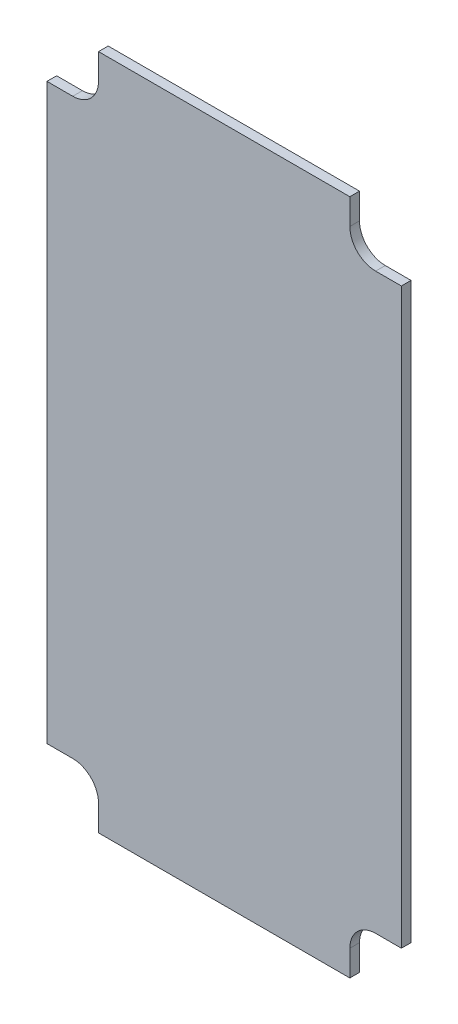
ISO-10303-21;
HEADER;
FILE_DESCRIPTION(('STEP AP214'),'2;1');
FILE_NAME('part.step','',(''),(''),'','','');
FILE_SCHEMA(('AUTOMOTIVE_DESIGN { 1 0 10303 214 1 1 1 1 }'));
ENDSEC;
DATA;
#1=APPLICATION_CONTEXT('core data for automotive mechanical design processes');
#2=APPLICATION_PROTOCOL_DEFINITION('international standard','automotive_design',2000,#1);
#3=PRODUCT_CONTEXT('',#1,'mechanical');
#4=PRODUCT('Part','Part','',(#3));
#5=PRODUCT_RELATED_PRODUCT_CATEGORY('part','',(#4));
#6=PRODUCT_DEFINITION_FORMATION('','',#4);
#7=PRODUCT_DEFINITION_CONTEXT('part definition',#1,'design');
#8=PRODUCT_DEFINITION('design','',#6,#7);
#9=PRODUCT_DEFINITION_SHAPE('','',#8);
#10=(LENGTH_UNIT() NAMED_UNIT(*) SI_UNIT(.MILLI.,.METRE.));
#11=(NAMED_UNIT(*) PLANE_ANGLE_UNIT() SI_UNIT($,.RADIAN.));
#12=(NAMED_UNIT(*) SI_UNIT($,.STERADIAN.) SOLID_ANGLE_UNIT());
#13=UNCERTAINTY_MEASURE_WITH_UNIT(LENGTH_MEASURE(1.E-05),#10,'distance_accuracy_value','');
#14=(GEOMETRIC_REPRESENTATION_CONTEXT(3) GLOBAL_UNCERTAINTY_ASSIGNED_CONTEXT((#13)) GLOBAL_UNIT_ASSIGNED_CONTEXT((#10,
#11,#12)) REPRESENTATION_CONTEXT('',''));
#15=CARTESIAN_POINT('',(0.,0.,0.));
#16=DIRECTION('',(0.,0.,1.));
#17=DIRECTION('',(1.,0.,0.));
#18=AXIS2_PLACEMENT_3D('',#15,#16,#17);
#19=CARTESIAN_POINT('',(27.5,-52.5,1.5));
#20=DIRECTION('',(-1.,0.,0.));
#21=DIRECTION('',(0.,0.,1.));
#22=AXIS2_PLACEMENT_3D('',#19,#20,#21);
#23=PLANE('',#22);
#24=DIRECTION('',(0.,1.,0.));
#25=VECTOR('',#24,1.);
#26=CARTESIAN_POINT('',(27.5,-52.5,0.));
#27=LINE('',#26,#25);
#28=CARTESIAN_POINT('',(27.5,-44.5,0.));
#29=VERTEX_POINT('',#28);
#30=CARTESIAN_POINT('',(27.5,44.5,0.));
#31=VERTEX_POINT('',#30);
#32=EDGE_CURVE('E175',#29,#31,#27,.T.);
#33=ORIENTED_EDGE('',*,*,#32,.T.);
#34=DIRECTION('',(0.,0.,1.));
#35=VECTOR('',#34,1.);
#36=CARTESIAN_POINT('',(27.5,44.5,-0.000999999999999916));
#37=LINE('',#36,#35);
#38=CARTESIAN_POINT('',(27.5,44.5,1.5));
#39=VERTEX_POINT('',#38);
#40=EDGE_CURVE('E57',#31,#39,#37,.T.);
#41=ORIENTED_EDGE('',*,*,#40,.T.);
#42=DIRECTION('',(0.,1.,0.));
#43=VECTOR('',#42,1.);
#44=CARTESIAN_POINT('',(27.5,-52.5,1.5));
#45=LINE('',#44,#43);
#46=CARTESIAN_POINT('',(27.5,-44.5,1.5));
#47=VERTEX_POINT('',#46);
#48=EDGE_CURVE('E173',#47,#39,#45,.T.);
#49=ORIENTED_EDGE('',*,*,#48,.F.);
#50=DIRECTION('',(0.,0.,1.));
#51=VECTOR('',#50,1.);
#52=CARTESIAN_POINT('',(27.5,-44.5,-0.000999999999999916));
#53=LINE('',#52,#51);
#54=EDGE_CURVE('E219',#29,#47,#53,.T.);
#55=ORIENTED_EDGE('',*,*,#54,.F.);
#56=EDGE_LOOP('',(#33,#41,#49,#55));
#57=FACE_BOUND('',#56,.T.);
#58=ADVANCED_FACE('F33',(#57),#23,.F.);
#59=CARTESIAN_POINT('',(-27.5,52.5,1.5));
#60=DIRECTION('',(0.,-1.,0.));
#61=DIRECTION('',(0.,0.,-1.));
#62=AXIS2_PLACEMENT_3D('',#59,#60,#61);
#63=PLANE('',#62);
#64=DIRECTION('',(-1.,0.,0.));
#65=VECTOR('',#64,1.);
#66=CARTESIAN_POINT('',(-27.5,52.5,0.));
#67=LINE('',#66,#65);
#68=CARTESIAN_POINT('',(19.5,52.5,0.));
#69=VERTEX_POINT('',#68);
#70=CARTESIAN_POINT('',(-19.5,52.5,0.));
#71=VERTEX_POINT('',#70);
#72=EDGE_CURVE('E171',#69,#71,#67,.T.);
#73=ORIENTED_EDGE('',*,*,#72,.T.);
#74=DIRECTION('',(0.,0.,1.));
#75=VECTOR('',#74,1.);
#76=CARTESIAN_POINT('',(-19.5,52.5,-0.000999999999999916));
#77=LINE('',#76,#75);
#78=CARTESIAN_POINT('',(-19.5,52.5,1.5));
#79=VERTEX_POINT('',#78);
#80=EDGE_CURVE('E49',#71,#79,#77,.T.);
#81=ORIENTED_EDGE('',*,*,#80,.T.);
#82=DIRECTION('',(-1.,0.,0.));
#83=VECTOR('',#82,1.);
#84=CARTESIAN_POINT('',(-27.5,52.5,1.5));
#85=LINE('',#84,#83);
#86=CARTESIAN_POINT('',(19.5,52.5,1.5));
#87=VERTEX_POINT('',#86);
#88=EDGE_CURVE('E181',#87,#79,#85,.T.);
#89=ORIENTED_EDGE('',*,*,#88,.F.);
#90=DIRECTION('',(0.,0.,1.));
#91=VECTOR('',#90,1.);
#92=CARTESIAN_POINT('',(19.5,52.5,-0.000999999999999916));
#93=LINE('',#92,#91);
#94=EDGE_CURVE('E242',#69,#87,#93,.T.);
#95=ORIENTED_EDGE('',*,*,#94,.F.);
#96=EDGE_LOOP('',(#73,#81,#89,#95));
#97=FACE_BOUND('',#96,.T.);
#98=ADVANCED_FACE('F280',(#97),#63,.F.);
#99=CARTESIAN_POINT('',(-27.5,-52.5,1.5));
#100=DIRECTION('',(1.,0.,0.));
#101=DIRECTION('',(0.,0.,-1.));
#102=AXIS2_PLACEMENT_3D('',#99,#100,#101);
#103=PLANE('',#102);
#104=DIRECTION('',(0.,-1.,0.));
#105=VECTOR('',#104,1.);
#106=CARTESIAN_POINT('',(-27.5,-52.5,1.5));
#107=LINE('',#106,#105);
#108=CARTESIAN_POINT('',(-27.5,44.5,1.5));
#109=VERTEX_POINT('',#108);
#110=CARTESIAN_POINT('',(-27.5,-44.5,1.5));
#111=VERTEX_POINT('',#110);
#112=EDGE_CURVE('E41',#109,#111,#107,.T.);
#113=ORIENTED_EDGE('',*,*,#112,.F.);
#114=DIRECTION('',(0.,0.,1.));
#115=VECTOR('',#114,1.);
#116=CARTESIAN_POINT('',(-27.5,44.5,-0.000999999999999916));
#117=LINE('',#116,#115);
#118=CARTESIAN_POINT('',(-27.5,44.5,0.));
#119=VERTEX_POINT('',#118);
#120=EDGE_CURVE('E151',#119,#109,#117,.T.);
#121=ORIENTED_EDGE('',*,*,#120,.F.);
#122=DIRECTION('',(0.,-1.,0.));
#123=VECTOR('',#122,1.);
#124=CARTESIAN_POINT('',(-27.5,-52.5,0.));
#125=LINE('',#124,#123);
#126=CARTESIAN_POINT('',(-27.5,-44.5,0.));
#127=VERTEX_POINT('',#126);
#128=EDGE_CURVE('E164',#119,#127,#125,.T.);
#129=ORIENTED_EDGE('',*,*,#128,.T.);
#130=DIRECTION('',(0.,0.,1.));
#131=VECTOR('',#130,1.);
#132=CARTESIAN_POINT('',(-27.5,-44.5,-0.000999999999999916));
#133=LINE('',#132,#131);
#134=EDGE_CURVE('E190',#127,#111,#133,.T.);
#135=ORIENTED_EDGE('',*,*,#134,.T.);
#136=EDGE_LOOP('',(#113,#121,#129,#135));
#137=FACE_BOUND('',#136,.T.);
#138=ADVANCED_FACE('F162',(#137),#103,.F.);
#139=CARTESIAN_POINT('',(-27.5,-52.5,1.5));
#140=DIRECTION('',(0.,1.,0.));
#141=DIRECTION('',(0.,0.,1.));
#142=AXIS2_PLACEMENT_3D('',#139,#140,#141);
#143=PLANE('',#142);
#144=DIRECTION('',(1.,0.,0.));
#145=VECTOR('',#144,1.);
#146=CARTESIAN_POINT('',(-27.5,-52.5,0.));
#147=LINE('',#146,#145);
#148=CARTESIAN_POINT('',(-19.5,-52.5,0.));
#149=VERTEX_POINT('',#148);
#150=CARTESIAN_POINT('',(19.5,-52.5,0.));
#151=VERTEX_POINT('',#150);
#152=EDGE_CURVE('E36',#149,#151,#147,.T.);
#153=ORIENTED_EDGE('',*,*,#152,.T.);
#154=DIRECTION('',(0.,0.,1.));
#155=VECTOR('',#154,1.);
#156=CARTESIAN_POINT('',(19.5,-52.5,-0.000999999999999916));
#157=LINE('',#156,#155);
#158=CARTESIAN_POINT('',(19.5,-52.5,1.5));
#159=VERTEX_POINT('',#158);
#160=EDGE_CURVE('E215',#151,#159,#157,.T.);
#161=ORIENTED_EDGE('',*,*,#160,.T.);
#162=DIRECTION('',(1.,0.,0.));
#163=VECTOR('',#162,1.);
#164=CARTESIAN_POINT('',(-27.5,-52.5,1.5));
#165=LINE('',#164,#163);
#166=CARTESIAN_POINT('',(-19.5,-52.5,1.5));
#167=VERTEX_POINT('',#166);
#168=EDGE_CURVE('E11',#167,#159,#165,.T.);
#169=ORIENTED_EDGE('',*,*,#168,.F.);
#170=DIRECTION('',(0.,0.,1.));
#171=VECTOR('',#170,1.);
#172=CARTESIAN_POINT('',(-19.5,-52.5,-0.000999999999999916));
#173=LINE('',#172,#171);
#174=EDGE_CURVE('E193',#149,#167,#173,.T.);
#175=ORIENTED_EDGE('',*,*,#174,.F.);
#176=EDGE_LOOP('',(#153,#161,#169,#175));
#177=FACE_BOUND('',#176,.T.);
#178=ADVANCED_FACE('F311',(#177),#143,.F.);
#179=CARTESIAN_POINT('',(0.,0.,1.5));
#180=DIRECTION('',(0.,0.,-1.));
#181=DIRECTION('',(-1.,0.,0.));
#182=AXIS2_PLACEMENT_3D('',#179,#180,#181);
#183=PLANE('',#182);
#184=CARTESIAN_POINT('',(-23.5,48.5,1.5));
#185=DIRECTION('',(0.,0.,1.));
#186=DIRECTION('',(1.,0.,0.));
#187=AXIS2_PLACEMENT_3D('',#184,#185,#186);
#188=CIRCLE('',#187,4.);
#189=CARTESIAN_POINT('',(-23.5,44.5,1.5));
#190=VERTEX_POINT('',#189);
#191=CARTESIAN_POINT('',(-19.5,48.5,1.5));
#192=VERTEX_POINT('',#191);
#193=EDGE_CURVE('E157',#190,#192,#188,.T.);
#194=ORIENTED_EDGE('',*,*,#193,.F.);
#195=DIRECTION('',(1.,0.,0.));
#196=VECTOR('',#195,1.);
#197=CARTESIAN_POINT('',(-23.5,44.5,1.5));
#198=LINE('',#197,#196);
#199=EDGE_CURVE('E262',#109,#190,#198,.T.);
#200=ORIENTED_EDGE('',*,*,#199,.F.);
#201=ORIENTED_EDGE('',*,*,#112,.T.);
#202=DIRECTION('',(-1.,0.,0.));
#203=VECTOR('',#202,1.);
#204=CARTESIAN_POINT('',(-23.5,-44.5,1.5));
#205=LINE('',#204,#203);
#206=CARTESIAN_POINT('',(-23.5,-44.5,1.5));
#207=VERTEX_POINT('',#206);
#208=EDGE_CURVE('E198',#207,#111,#205,.T.);
#209=ORIENTED_EDGE('',*,*,#208,.F.);
#210=CARTESIAN_POINT('',(-23.5,-48.5,1.5));
#211=DIRECTION('',(0.,0.,1.));
#212=DIRECTION('',(-1.,0.,0.));
#213=AXIS2_PLACEMENT_3D('',#210,#211,#212);
#214=CIRCLE('',#213,4.00000000000001);
#215=CARTESIAN_POINT('',(-19.5,-48.5,1.5));
#216=VERTEX_POINT('',#215);
#217=EDGE_CURVE('E201',#216,#207,#214,.T.);
#218=ORIENTED_EDGE('',*,*,#217,.F.);
#219=DIRECTION('',(0.,1.,0.));
#220=VECTOR('',#219,1.);
#221=CARTESIAN_POINT('',(-19.5,-48.5,1.5));
#222=LINE('',#221,#220);
#223=EDGE_CURVE('E191',#167,#216,#222,.T.);
#224=ORIENTED_EDGE('',*,*,#223,.F.);
#225=ORIENTED_EDGE('',*,*,#168,.T.);
#226=DIRECTION('',(0.,-1.,0.));
#227=VECTOR('',#226,1.);
#228=CARTESIAN_POINT('',(19.5,-48.5,1.5));
#229=LINE('',#228,#227);
#230=CARTESIAN_POINT('',(19.5,-48.5,1.5));
#231=VERTEX_POINT('',#230);
#232=EDGE_CURVE('E224',#231,#159,#229,.T.);
#233=ORIENTED_EDGE('',*,*,#232,.F.);
#234=CARTESIAN_POINT('',(23.5,-48.5,1.5));
#235=DIRECTION('',(0.,0.,1.));
#236=DIRECTION('',(1.,0.,0.));
#237=AXIS2_PLACEMENT_3D('',#234,#235,#236);
#238=CIRCLE('',#237,4.);
#239=CARTESIAN_POINT('',(23.5,-44.5,1.5));
#240=VERTEX_POINT('',#239);
#241=EDGE_CURVE('E226',#240,#231,#238,.T.);
#242=ORIENTED_EDGE('',*,*,#241,.F.);
#243=DIRECTION('',(-1.,0.,0.));
#244=VECTOR('',#243,1.);
#245=CARTESIAN_POINT('',(23.5,-44.5,1.5));
#246=LINE('',#245,#244);
#247=EDGE_CURVE('E216',#47,#240,#246,.T.);
#248=ORIENTED_EDGE('',*,*,#247,.F.);
#249=ORIENTED_EDGE('',*,*,#48,.T.);
#250=DIRECTION('',(1.,0.,0.));
#251=VECTOR('',#250,1.);
#252=CARTESIAN_POINT('',(23.5,44.5,1.5));
#253=LINE('',#252,#251);
#254=CARTESIAN_POINT('',(23.5,44.5,1.5));
#255=VERTEX_POINT('',#254);
#256=EDGE_CURVE('E247',#255,#39,#253,.T.);
#257=ORIENTED_EDGE('',*,*,#256,.F.);
#258=CARTESIAN_POINT('',(23.5,48.5,1.5));
#259=DIRECTION('',(0.,0.,1.));
#260=DIRECTION('',(-1.,0.,0.));
#261=AXIS2_PLACEMENT_3D('',#258,#259,#260);
#262=CIRCLE('',#261,4.);
#263=CARTESIAN_POINT('',(19.5,48.5,1.5));
#264=VERTEX_POINT('',#263);
#265=EDGE_CURVE('E249',#264,#255,#262,.T.);
#266=ORIENTED_EDGE('',*,*,#265,.F.);
#267=DIRECTION('',(0.,-1.,0.));
#268=VECTOR('',#267,1.);
#269=CARTESIAN_POINT('',(19.5,48.5,1.5));
#270=LINE('',#269,#268);
#271=EDGE_CURVE('E240',#87,#264,#270,.T.);
#272=ORIENTED_EDGE('',*,*,#271,.F.);
#273=ORIENTED_EDGE('',*,*,#88,.T.);
#274=DIRECTION('',(0.,1.,0.));
#275=VECTOR('',#274,1.);
#276=CARTESIAN_POINT('',(-19.5,48.5,1.5));
#277=LINE('',#276,#275);
#278=EDGE_CURVE('E266',#192,#79,#277,.T.);
#279=ORIENTED_EDGE('',*,*,#278,.F.);
#280=EDGE_LOOP('',(#194,#200,#201,#209,#218,#224,#225,#233,#242,#248,#249,#257,#266,#272,#273,#279));
#281=FACE_BOUND('',#280,.T.);
#282=ADVANCED_FACE('F283',(#281),#183,.F.);
#283=CARTESIAN_POINT('',(0.,0.,0.));
#284=DIRECTION('',(0.,0.,-1.));
#285=DIRECTION('',(-1.,0.,0.));
#286=AXIS2_PLACEMENT_3D('',#283,#284,#285);
#287=PLANE('',#286);
#288=DIRECTION('',(1.,0.,0.));
#289=VECTOR('',#288,1.);
#290=CARTESIAN_POINT('',(-23.5,44.5,0.));
#291=LINE('',#290,#289);
#292=CARTESIAN_POINT('',(-23.5,44.5,0.));
#293=VERTEX_POINT('',#292);
#294=EDGE_CURVE('E147',#119,#293,#291,.T.);
#295=ORIENTED_EDGE('',*,*,#294,.T.);
#296=CARTESIAN_POINT('',(-23.5,48.5,0.));
#297=DIRECTION('',(0.,0.,-1.));
#298=DIRECTION('',(-1.,0.,0.));
#299=AXIS2_PLACEMENT_3D('',#296,#297,#298);
#300=CIRCLE('',#299,4.);
#301=CARTESIAN_POINT('',(-19.5,48.5,0.));
#302=VERTEX_POINT('',#301);
#303=EDGE_CURVE('E158',#293,#302,#300,.F.);
#304=ORIENTED_EDGE('',*,*,#303,.T.);
#305=DIRECTION('',(0.,1.,0.));
#306=VECTOR('',#305,1.);
#307=CARTESIAN_POINT('',(-19.5,48.5,0.));
#308=LINE('',#307,#306);
#309=EDGE_CURVE('E258',#302,#71,#308,.T.);
#310=ORIENTED_EDGE('',*,*,#309,.T.);
#311=ORIENTED_EDGE('',*,*,#72,.F.);
#312=DIRECTION('',(0.,-1.,0.));
#313=VECTOR('',#312,1.);
#314=CARTESIAN_POINT('',(19.5,48.5,0.));
#315=LINE('',#314,#313);
#316=CARTESIAN_POINT('',(19.5,48.5,0.));
#317=VERTEX_POINT('',#316);
#318=EDGE_CURVE('E252',#69,#317,#315,.T.);
#319=ORIENTED_EDGE('',*,*,#318,.T.);
#320=CARTESIAN_POINT('',(23.5,48.5,0.));
#321=DIRECTION('',(0.,0.,-1.));
#322=DIRECTION('',(-1.,0.,0.));
#323=AXIS2_PLACEMENT_3D('',#320,#321,#322);
#324=CIRCLE('',#323,4.);
#325=CARTESIAN_POINT('',(23.5,44.5,0.));
#326=VERTEX_POINT('',#325);
#327=EDGE_CURVE('E255',#317,#326,#324,.F.);
#328=ORIENTED_EDGE('',*,*,#327,.T.);
#329=DIRECTION('',(1.,0.,0.));
#330=VECTOR('',#329,1.);
#331=CARTESIAN_POINT('',(23.5,44.5,0.));
#332=LINE('',#331,#330);
#333=EDGE_CURVE('E235',#326,#31,#332,.T.);
#334=ORIENTED_EDGE('',*,*,#333,.T.);
#335=ORIENTED_EDGE('',*,*,#32,.F.);
#336=DIRECTION('',(-1.,0.,0.));
#337=VECTOR('',#336,1.);
#338=CARTESIAN_POINT('',(23.5,-44.5,0.));
#339=LINE('',#338,#337);
#340=CARTESIAN_POINT('',(23.5,-44.5,0.));
#341=VERTEX_POINT('',#340);
#342=EDGE_CURVE('E229',#29,#341,#339,.T.);
#343=ORIENTED_EDGE('',*,*,#342,.T.);
#344=CARTESIAN_POINT('',(23.5,-48.5,0.));
#345=DIRECTION('',(0.,0.,-1.));
#346=DIRECTION('',(-1.,0.,0.));
#347=AXIS2_PLACEMENT_3D('',#344,#345,#346);
#348=CIRCLE('',#347,4.);
#349=CARTESIAN_POINT('',(19.5,-48.5,0.));
#350=VERTEX_POINT('',#349);
#351=EDGE_CURVE('E232',#341,#350,#348,.F.);
#352=ORIENTED_EDGE('',*,*,#351,.T.);
#353=DIRECTION('',(0.,-1.,0.));
#354=VECTOR('',#353,1.);
#355=CARTESIAN_POINT('',(19.5,-48.5,0.));
#356=LINE('',#355,#354);
#357=EDGE_CURVE('E209',#350,#151,#356,.T.);
#358=ORIENTED_EDGE('',*,*,#357,.T.);
#359=ORIENTED_EDGE('',*,*,#152,.F.);
#360=DIRECTION('',(0.,1.,0.));
#361=VECTOR('',#360,1.);
#362=CARTESIAN_POINT('',(-19.5,-48.5,0.));
#363=LINE('',#362,#361);
#364=CARTESIAN_POINT('',(-19.5,-48.5,0.));
#365=VERTEX_POINT('',#364);
#366=EDGE_CURVE('E204',#149,#365,#363,.T.);
#367=ORIENTED_EDGE('',*,*,#366,.T.);
#368=CARTESIAN_POINT('',(-23.5,-48.5,0.));
#369=DIRECTION('',(0.,0.,-1.));
#370=DIRECTION('',(-1.,0.,0.));
#371=AXIS2_PLACEMENT_3D('',#368,#369,#370);
#372=CIRCLE('',#371,4.00000000000001);
#373=CARTESIAN_POINT('',(-23.5,-44.5,0.));
#374=VERTEX_POINT('',#373);
#375=EDGE_CURVE('E207',#365,#374,#372,.F.);
#376=ORIENTED_EDGE('',*,*,#375,.T.);
#377=DIRECTION('',(-1.,0.,0.));
#378=VECTOR('',#377,1.);
#379=CARTESIAN_POINT('',(-23.5,-44.5,0.));
#380=LINE('',#379,#378);
#381=EDGE_CURVE('E170',#374,#127,#380,.T.);
#382=ORIENTED_EDGE('',*,*,#381,.T.);
#383=ORIENTED_EDGE('',*,*,#128,.F.);
#384=EDGE_LOOP('',(#295,#304,#310,#311,#319,#328,#334,#335,#343,#352,#358,#359,#367,#376,#382,#383));
#385=FACE_BOUND('',#384,.T.);
#386=ADVANCED_FACE('F168',(#385),#287,.T.);
#387=CARTESIAN_POINT('',(-23.5,-48.5,-0.000999999999999916));
#388=DIRECTION('',(0.,0.,1.));
#389=DIRECTION('',(1.,0.,0.));
#390=AXIS2_PLACEMENT_3D('',#387,#388,#389);
#391=CYLINDRICAL_SURFACE('',#390,4.00000000000001);
#392=DIRECTION('',(0.,0.,1.));
#393=VECTOR('',#392,1.);
#394=CARTESIAN_POINT('',(-19.5,-48.5,-0.000999999999999916));
#395=LINE('',#394,#393);
#396=EDGE_CURVE('E187',#365,#216,#395,.T.);
#397=ORIENTED_EDGE('',*,*,#396,.T.);
#398=ORIENTED_EDGE('',*,*,#217,.T.);
#399=DIRECTION('',(0.,0.,1.));
#400=VECTOR('',#399,1.);
#401=CARTESIAN_POINT('',(-23.5,-44.5,-0.000999999999999916));
#402=LINE('',#401,#400);
#403=EDGE_CURVE('E188',#374,#207,#402,.T.);
#404=ORIENTED_EDGE('',*,*,#403,.F.);
#405=ORIENTED_EDGE('',*,*,#375,.F.);
#406=EDGE_LOOP('',(#397,#398,#404,#405));
#407=FACE_BOUND('',#406,.T.);
#408=ADVANCED_FACE('F321',(#407),#391,.F.);
#409=CARTESIAN_POINT('',(-19.5,-48.5,-0.000999999999999916));
#410=DIRECTION('',(1.,0.,0.));
#411=DIRECTION('',(0.,0.,-1.));
#412=AXIS2_PLACEMENT_3D('',#409,#410,#411);
#413=PLANE('',#412);
#414=ORIENTED_EDGE('',*,*,#174,.T.);
#415=ORIENTED_EDGE('',*,*,#223,.T.);
#416=ORIENTED_EDGE('',*,*,#396,.F.);
#417=ORIENTED_EDGE('',*,*,#366,.F.);
#418=EDGE_LOOP('',(#414,#415,#416,#417));
#419=FACE_BOUND('',#418,.T.);
#420=ADVANCED_FACE('F318',(#419),#413,.F.);
#421=CARTESIAN_POINT('',(-23.5,-44.5,-0.000999999999999916));
#422=DIRECTION('',(0.,1.,0.));
#423=DIRECTION('',(0.,0.,1.));
#424=AXIS2_PLACEMENT_3D('',#421,#422,#423);
#425=PLANE('',#424);
#426=ORIENTED_EDGE('',*,*,#403,.T.);
#427=ORIENTED_EDGE('',*,*,#208,.T.);
#428=ORIENTED_EDGE('',*,*,#134,.F.);
#429=ORIENTED_EDGE('',*,*,#381,.F.);
#430=EDGE_LOOP('',(#426,#427,#428,#429));
#431=FACE_BOUND('',#430,.T.);
#432=ADVANCED_FACE('F323',(#431),#425,.F.);
#433=CARTESIAN_POINT('',(23.5,-48.5,-0.000999999999999916));
#434=DIRECTION('',(0.,0.,1.));
#435=DIRECTION('',(1.,0.,0.));
#436=AXIS2_PLACEMENT_3D('',#433,#434,#435);
#437=CYLINDRICAL_SURFACE('',#436,4.);
#438=DIRECTION('',(0.,0.,1.));
#439=VECTOR('',#438,1.);
#440=CARTESIAN_POINT('',(23.5,-44.5,-0.000999999999999916));
#441=LINE('',#440,#439);
#442=EDGE_CURVE('E212',#341,#240,#441,.T.);
#443=ORIENTED_EDGE('',*,*,#442,.T.);
#444=ORIENTED_EDGE('',*,*,#241,.T.);
#445=DIRECTION('',(0.,0.,1.));
#446=VECTOR('',#445,1.);
#447=CARTESIAN_POINT('',(19.5,-48.5,-0.000999999999999916));
#448=LINE('',#447,#446);
#449=EDGE_CURVE('E213',#350,#231,#448,.T.);
#450=ORIENTED_EDGE('',*,*,#449,.F.);
#451=ORIENTED_EDGE('',*,*,#351,.F.);
#452=EDGE_LOOP('',(#443,#444,#450,#451));
#453=FACE_BOUND('',#452,.T.);
#454=ADVANCED_FACE('F306',(#453),#437,.F.);
#455=CARTESIAN_POINT('',(23.5,-44.5,-0.000999999999999916));
#456=DIRECTION('',(0.,1.,0.));
#457=DIRECTION('',(0.,0.,1.));
#458=AXIS2_PLACEMENT_3D('',#455,#456,#457);
#459=PLANE('',#458);
#460=ORIENTED_EDGE('',*,*,#54,.T.);
#461=ORIENTED_EDGE('',*,*,#247,.T.);
#462=ORIENTED_EDGE('',*,*,#442,.F.);
#463=ORIENTED_EDGE('',*,*,#342,.F.);
#464=EDGE_LOOP('',(#460,#461,#462,#463));
#465=FACE_BOUND('',#464,.T.);
#466=ADVANCED_FACE('F302',(#465),#459,.F.);
#467=CARTESIAN_POINT('',(19.5,-48.5,-0.000999999999999916));
#468=DIRECTION('',(-1.,0.,0.));
#469=DIRECTION('',(0.,-1.,0.));
#470=AXIS2_PLACEMENT_3D('',#467,#468,#469);
#471=PLANE('',#470);
#472=ORIENTED_EDGE('',*,*,#449,.T.);
#473=ORIENTED_EDGE('',*,*,#232,.T.);
#474=ORIENTED_EDGE('',*,*,#160,.F.);
#475=ORIENTED_EDGE('',*,*,#357,.F.);
#476=EDGE_LOOP('',(#472,#473,#474,#475));
#477=FACE_BOUND('',#476,.T.);
#478=ADVANCED_FACE('F308',(#477),#471,.F.);
#479=CARTESIAN_POINT('',(23.5,48.5,-0.000999999999999916));
#480=DIRECTION('',(0.,0.,1.));
#481=DIRECTION('',(1.,0.,0.));
#482=AXIS2_PLACEMENT_3D('',#479,#480,#481);
#483=CYLINDRICAL_SURFACE('',#482,4.);
#484=DIRECTION('',(0.,0.,1.));
#485=VECTOR('',#484,1.);
#486=CARTESIAN_POINT('',(19.5,48.5,-0.000999999999999916));
#487=LINE('',#486,#485);
#488=EDGE_CURVE('E237',#317,#264,#487,.T.);
#489=ORIENTED_EDGE('',*,*,#488,.T.);
#490=ORIENTED_EDGE('',*,*,#265,.T.);
#491=DIRECTION('',(0.,0.,1.));
#492=VECTOR('',#491,1.);
#493=CARTESIAN_POINT('',(23.5,44.5,-0.000999999999999916));
#494=LINE('',#493,#492);
#495=EDGE_CURVE('E238',#326,#255,#494,.T.);
#496=ORIENTED_EDGE('',*,*,#495,.F.);
#497=ORIENTED_EDGE('',*,*,#327,.F.);
#498=EDGE_LOOP('',(#489,#490,#496,#497));
#499=FACE_BOUND('',#498,.T.);
#500=ADVANCED_FACE('F292',(#499),#483,.F.);
#501=CARTESIAN_POINT('',(19.5,48.5,-0.000999999999999916));
#502=DIRECTION('',(-1.,0.,0.));
#503=DIRECTION('',(0.,0.,1.));
#504=AXIS2_PLACEMENT_3D('',#501,#502,#503);
#505=PLANE('',#504);
#506=ORIENTED_EDGE('',*,*,#94,.T.);
#507=ORIENTED_EDGE('',*,*,#271,.T.);
#508=ORIENTED_EDGE('',*,*,#488,.F.);
#509=ORIENTED_EDGE('',*,*,#318,.F.);
#510=EDGE_LOOP('',(#506,#507,#508,#509));
#511=FACE_BOUND('',#510,.T.);
#512=ADVANCED_FACE('F288',(#511),#505,.F.);
#513=CARTESIAN_POINT('',(23.5,44.5,-0.000999999999999916));
#514=DIRECTION('',(0.,-1.,0.));
#515=DIRECTION('',(1.,0.,0.));
#516=AXIS2_PLACEMENT_3D('',#513,#514,#515);
#517=PLANE('',#516);
#518=ORIENTED_EDGE('',*,*,#495,.T.);
#519=ORIENTED_EDGE('',*,*,#256,.T.);
#520=ORIENTED_EDGE('',*,*,#40,.F.);
#521=ORIENTED_EDGE('',*,*,#333,.F.);
#522=EDGE_LOOP('',(#518,#519,#520,#521));
#523=FACE_BOUND('',#522,.T.);
#524=ADVANCED_FACE('F293',(#523),#517,.F.);
#525=CARTESIAN_POINT('',(-23.5,48.5,-0.000999999999999916));
#526=DIRECTION('',(0.,0.,1.));
#527=DIRECTION('',(1.,0.,0.));
#528=AXIS2_PLACEMENT_3D('',#525,#526,#527);
#529=CYLINDRICAL_SURFACE('',#528,4.);
#530=DIRECTION('',(0.,0.,1.));
#531=VECTOR('',#530,1.);
#532=CARTESIAN_POINT('',(-23.5,44.5,-0.000999999999999916));
#533=LINE('',#532,#531);
#534=EDGE_CURVE('E153',#293,#190,#533,.T.);
#535=ORIENTED_EDGE('',*,*,#534,.T.);
#536=ORIENTED_EDGE('',*,*,#193,.T.);
#537=DIRECTION('',(0.,0.,1.));
#538=VECTOR('',#537,1.);
#539=CARTESIAN_POINT('',(-19.5,48.5,-0.000999999999999916));
#540=LINE('',#539,#538);
#541=EDGE_CURVE('E260',#302,#192,#540,.T.);
#542=ORIENTED_EDGE('',*,*,#541,.F.);
#543=ORIENTED_EDGE('',*,*,#303,.F.);
#544=EDGE_LOOP('',(#535,#536,#542,#543));
#545=FACE_BOUND('',#544,.T.);
#546=ADVANCED_FACE('F273',(#545),#529,.F.);
#547=CARTESIAN_POINT('',(-23.5,44.5,-0.000999999999999916));
#548=DIRECTION('',(0.,-1.,0.));
#549=DIRECTION('',(1.,0.,0.));
#550=AXIS2_PLACEMENT_3D('',#547,#548,#549);
#551=PLANE('',#550);
#552=ORIENTED_EDGE('',*,*,#120,.T.);
#553=ORIENTED_EDGE('',*,*,#199,.T.);
#554=ORIENTED_EDGE('',*,*,#534,.F.);
#555=ORIENTED_EDGE('',*,*,#294,.F.);
#556=EDGE_LOOP('',(#552,#553,#554,#555));
#557=FACE_BOUND('',#556,.T.);
#558=ADVANCED_FACE('F149',(#557),#551,.F.);
#559=CARTESIAN_POINT('',(-19.5,48.5,-0.000999999999999916));
#560=DIRECTION('',(1.,0.,0.));
#561=DIRECTION('',(0.,1.,0.));
#562=AXIS2_PLACEMENT_3D('',#559,#560,#561);
#563=PLANE('',#562);
#564=ORIENTED_EDGE('',*,*,#541,.T.);
#565=ORIENTED_EDGE('',*,*,#278,.T.);
#566=ORIENTED_EDGE('',*,*,#80,.F.);
#567=ORIENTED_EDGE('',*,*,#309,.F.);
#568=EDGE_LOOP('',(#564,#565,#566,#567));
#569=FACE_BOUND('',#568,.T.);
#570=ADVANCED_FACE('F276',(#569),#563,.F.);
#571=CLOSED_SHELL('',(#58,#98,#138,#178,#282,#386,#408,#420,#432,#454,#466,#478,#500,#512,#524,
#546,#558,#570));
#572=MANIFOLD_SOLID_BREP('B2',#571);
#573=ADVANCED_BREP_SHAPE_REPRESENTATION('',(#18,#572),#14);
#574=SHAPE_DEFINITION_REPRESENTATION(#9,#573);
ENDSEC;
END-ISO-10303-21;
